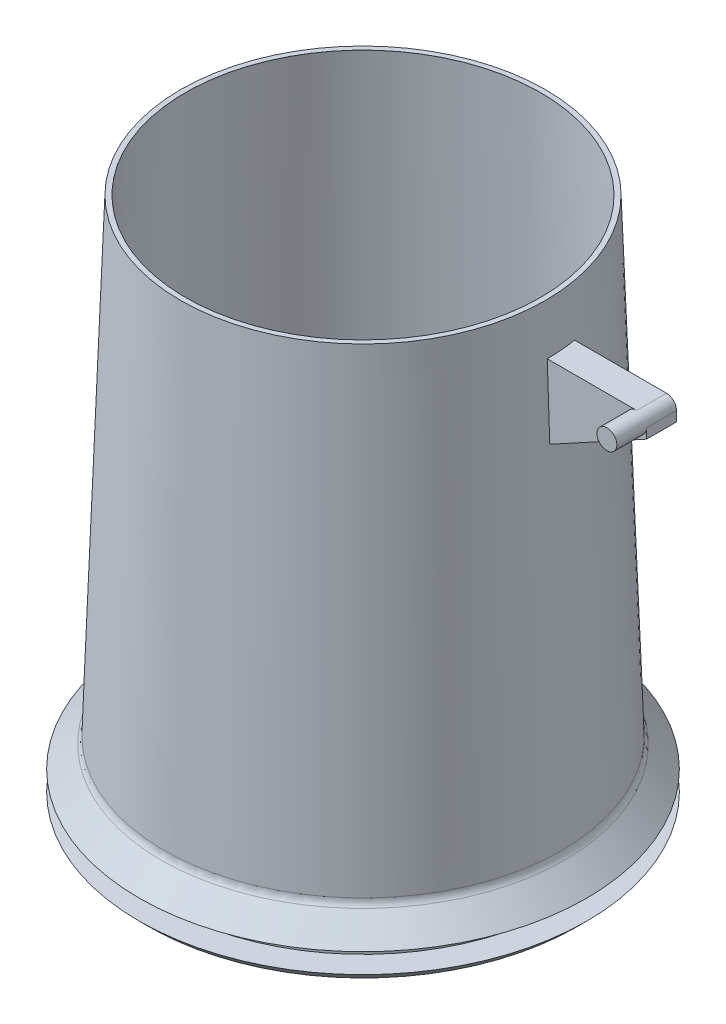
ISO-10303-21;
HEADER;
FILE_DESCRIPTION(('STEP AP214'),'2;1');
FILE_NAME('part.step','',(''),(''),'','','');
FILE_SCHEMA(('AUTOMOTIVE_DESIGN { 1 0 10303 214 1 1 1 1 }'));
ENDSEC;
DATA;
#1=APPLICATION_CONTEXT('core data for automotive mechanical design processes');
#2=APPLICATION_PROTOCOL_DEFINITION('international standard','automotive_design',2000,#1);
#3=PRODUCT_CONTEXT('',#1,'mechanical');
#4=PRODUCT('Part','Part','',(#3));
#5=PRODUCT_RELATED_PRODUCT_CATEGORY('part','',(#4));
#6=PRODUCT_DEFINITION_FORMATION('','',#4);
#7=PRODUCT_DEFINITION_CONTEXT('part definition',#1,'design');
#8=PRODUCT_DEFINITION('design','',#6,#7);
#9=PRODUCT_DEFINITION_SHAPE('','',#8);
#10=(LENGTH_UNIT() NAMED_UNIT(*) SI_UNIT(.MILLI.,.METRE.));
#11=(NAMED_UNIT(*) PLANE_ANGLE_UNIT() SI_UNIT($,.RADIAN.));
#12=(NAMED_UNIT(*) SI_UNIT($,.STERADIAN.) SOLID_ANGLE_UNIT());
#13=UNCERTAINTY_MEASURE_WITH_UNIT(LENGTH_MEASURE(1.E-05),#10,'distance_accuracy_value','');
#14=(GEOMETRIC_REPRESENTATION_CONTEXT(3) GLOBAL_UNCERTAINTY_ASSIGNED_CONTEXT((#13)) GLOBAL_UNIT_ASSIGNED_CONTEXT((#10,
#11,#12)) REPRESENTATION_CONTEXT('',''));
#15=CARTESIAN_POINT('',(0.,0.,0.));
#16=DIRECTION('',(0.,0.,1.));
#17=DIRECTION('',(1.,0.,0.));
#18=AXIS2_PLACEMENT_3D('',#15,#16,#17);
#19=CARTESIAN_POINT('',(0.,0.,0.));
#20=DIRECTION('',(0.,0.,1.));
#21=DIRECTION('',(1.,0.,0.));
#22=AXIS2_PLACEMENT_3D('',#19,#20,#21);
#23=PLANE('',#22);
#24=DIRECTION('',(0.,1.,0.));
#25=VECTOR('',#24,1.);
#26=CARTESIAN_POINT('',(28.530331952933,2.22044604925031E-13,2.22261445359528E-13));
#27=LINE('',#26,#25);
#28=CARTESIAN_POINT('',(28.5303319529329,43.0000000000001,2.22369865576777E-13));
#29=VERTEX_POINT('',#28);
#30=CARTESIAN_POINT('',(28.5303319529329,44.,1.11347563114261E-13));
#31=VERTEX_POINT('',#30);
#32=EDGE_CURVE('E128',#29,#31,#27,.T.);
#33=ORIENTED_EDGE('',*,*,#32,.T.);
#34=CARTESIAN_POINT('',(27.5303319529328,44.,1.1145598333151E-13));
#35=DIRECTION('',(0.,0.,1.));
#36=DIRECTION('',(1.,0.,0.));
#37=AXIS2_PLACEMENT_3D('',#34,#35,#36);
#38=CIRCLE('',#37,1.);
#39=CARTESIAN_POINT('',(27.5303319529328,45.0000000000004,1.11347563114261E-13));
#40=VERTEX_POINT('',#39);
#41=EDGE_CURVE('E11',#31,#40,#38,.F.);
#42=ORIENTED_EDGE('',*,*,#41,.T.);
#43=DIRECTION('',(-1.,0.,0.));
#44=VECTOR('',#43,1.);
#45=CARTESIAN_POINT('',(2.42861286636753E-13,45.0000000000001,1.11130722679764E-13));
#46=LINE('',#45,#44);
#47=CARTESIAN_POINT('',(18.5303319529329,45.0000000000001,1.11347563114261E-13));
#48=VERTEX_POINT('',#47);
#49=EDGE_CURVE('E102',#40,#48,#46,.T.);
#50=ORIENTED_EDGE('',*,*,#49,.T.);
#51=DIRECTION('',(-0.0348994967025014,0.999390827019095,0.));
#52=VECTOR('',#51,1.);
#53=CARTESIAN_POINT('',(2.08166817117217E-13,575.639279220674,0.));
#54=LINE('',#53,#52);
#55=CARTESIAN_POINT('',(18.7858095543698,37.6840786971369,1.11347563114261E-13));
#56=VERTEX_POINT('',#55);
#57=EDGE_CURVE('E194',#48,#56,#54,.F.);
#58=ORIENTED_EDGE('',*,*,#57,.T.);
#59=DIRECTION('',(0.877868028730685,0.478902624896233,0.));
#60=VECTOR('',#59,1.);
#61=CARTESIAN_POINT('',(-11.534405338529,21.1435167625347,2.21936184707783E-13));
#62=LINE('',#61,#60);
#63=EDGE_CURVE('E111',#56,#29,#62,.T.);
#64=ORIENTED_EDGE('',*,*,#63,.T.);
#65=EDGE_LOOP('',(#33,#42,#50,#58,#64));
#66=FACE_BOUND('',#65,.T.);
#67=ADVANCED_FACE('F55',(#66),#23,.T.);
#68=CARTESIAN_POINT('',(1.11022302462516E-13,2.9142135623732,1.10913882245267E-13));
#69=DIRECTION('',(0.,-1.,0.));
#70=DIRECTION('',(1.,0.,0.));
#71=AXIS2_PLACEMENT_3D('',#68,#69,#70);
#72=CONICAL_SURFACE('',#71,20.,0.0349065850398873);
#73=CARTESIAN_POINT('',(0.,50.,1.11130722679764E-13));
#74=DIRECTION('',(0.,-1.,0.));
#75=DIRECTION('',(1.,0.,0.));
#76=AXIS2_PLACEMENT_3D('',#73,#74,#75);
#77=CIRCLE('',#76,18.3557281054739);
#78=CARTESIAN_POINT('',(18.3557281054739,50.,1.11703880704102E-13));
#79=VERTEX_POINT('',#78);
#80=EDGE_CURVE('E182',#79,#79,#77,.T.);
#81=ORIENTED_EDGE('',*,*,#80,.T.);
#82=EDGE_LOOP('',(#81));
#83=FACE_BOUND('',#82,.T.);
#84=CARTESIAN_POINT('',(1.11022302462516E-13,2.9142135623732,1.10913882245267E-13));
#85=DIRECTION('',(0.,-1.,0.));
#86=DIRECTION('',(1.,0.,0.));
#87=AXIS2_PLACEMENT_3D('',#84,#85,#86);
#88=CIRCLE('',#87,20.);
#89=CARTESIAN_POINT('',(20.0000000000001,2.91421356237321,1.11538382696619E-13));
#90=VERTEX_POINT('',#89);
#91=EDGE_CURVE('E186',#90,#90,#88,.T.);
#92=ORIENTED_EDGE('',*,*,#91,.F.);
#93=EDGE_LOOP('',(#92));
#94=FACE_BOUND('',#93,.T.);
#95=CARTESIAN_POINT('',(2.42861286636753E-13,45.0000000000001,1.11130722679764E-13));
#96=DIRECTION('',(0.,1.,0.));
#97=DIRECTION('',(-1.,0.,0.));
#98=AXIS2_PLACEMENT_3D('',#95,#96,#97);
#99=CIRCLE('',#98,18.5303319529327);
#100=CARTESIAN_POINT('',(18.2858743921608,45.0000000000001,-2.99999999999978));
#101=VERTEX_POINT('',#100);
#102=EDGE_CURVE('E75',#101,#48,#99,.F.);
#103=ORIENTED_EDGE('',*,*,#102,.F.);
#104=CARTESIAN_POINT('',(18.0199111100321,52.5142637070481,-2.99999999999989));
#105=CARTESIAN_POINT('',(18.1517468798483,48.7901915058977,-2.99999999999989));
#106=CARTESIAN_POINT('',(18.2835461188556,45.0661180122388,-2.99999999999989));
#107=CARTESIAN_POINT('',(18.5470715352514,37.617968439919,-2.99999999999989));
#108=CARTESIAN_POINT('',(18.67879771264,33.8938923612581,-2.99999999999989));
#109=CARTESIAN_POINT('',(18.8104873592195,30.1698149900886,-2.99999999999989));
#110=B_SPLINE_CURVE_WITH_KNOTS('',3,(#104,#105,#106,#107,#108,#109),.UNSPECIFIED.,.F.,.F.,(4,2,
4),(0.,11.1792150811308,22.3584301622165),.UNSPECIFIED.);
#111=CARTESIAN_POINT('',(18.5447200198077,37.6840786971371,-2.99999999999989));
#112=VERTEX_POINT('',#111);
#113=EDGE_CURVE('E64',#101,#112,#110,.T.);
#114=ORIENTED_EDGE('',*,*,#113,.T.);
#115=CARTESIAN_POINT('',(0.,37.6840786971371,1.11130722679764E-13));
#116=DIRECTION('',(0.,-1.,0.));
#117=DIRECTION('',(0.,0.,-1.));
#118=AXIS2_PLACEMENT_3D('',#115,#116,#117);
#119=CIRCLE('',#118,18.7858095543697);
#120=EDGE_CURVE('E199',#56,#112,#119,.F.);
#121=ORIENTED_EDGE('',*,*,#120,.F.);
#122=ORIENTED_EDGE('',*,*,#57,.F.);
#123=EDGE_LOOP('',(#103,#114,#121,#122));
#124=FACE_BOUND('',#123,.T.);
#125=ADVANCED_FACE('F208',(#83,#94,#124),#72,.T.);
#126=CARTESIAN_POINT('',(0.,0.,0.));
#127=DIRECTION('',(0.,-1.,0.));
#128=DIRECTION('',(1.,0.,0.));
#129=AXIS2_PLACEMENT_3D('',#126,#127,#128);
#130=CONICAL_SURFACE('',#129,22.5,0.785398163397454);
#131=CARTESIAN_POINT('',(1.11022302462516E-13,2.20710678118662,1.11022302462516E-13));
#132=DIRECTION('',(0.,-1.,0.));
#133=DIRECTION('',(1.,0.,0.));
#134=AXIS2_PLACEMENT_3D('',#131,#132,#133);
#135=CIRCLE('',#134,20.2928932188135);
#136=CARTESIAN_POINT('',(20.2928932188134,2.20710678118661,0.));
#137=VERTEX_POINT('',#136);
#138=EDGE_CURVE('E190',#137,#137,#135,.T.);
#139=CARTESIAN_POINT('',(0.,0.,0.));
#140=DIRECTION('',(0.,-1.,0.));
#141=DIRECTION('',(1.,0.,0.));
#142=AXIS2_PLACEMENT_3D('',#139,#140,#141);
#143=CIRCLE('',#142,22.5);
#144=CARTESIAN_POINT('',(22.5,0.,0.));
#145=VERTEX_POINT('',#144);
#146=EDGE_CURVE('E144',#145,#145,#143,.T.);
#147=CARTESIAN_POINT('',(20.2928932188134,2.20710678118661,0.));
#148=CARTESIAN_POINT('',(20.3158839144507,2.18411608554925,0.));
#149=CARTESIAN_POINT('',(20.3388746100881,2.16112538991189,0.));
#150=CARTESIAN_POINT('',(20.3848560013628,2.11514399863717,0.));
#151=CARTESIAN_POINT('',(20.4078466970002,2.09215330299981,0.));
#152=CARTESIAN_POINT('',(20.4538280882749,2.04617191172509,0.));
#153=CARTESIAN_POINT('',(20.4768187839123,2.02318121608772,0.));
#154=CARTESIAN_POINT('',(20.522800175187,1.977199824813,0.));
#155=CARTESIAN_POINT('',(20.5457908708243,1.95420912917564,0.));
#156=CARTESIAN_POINT('',(20.5917722620991,1.90822773790092,0.));
#157=CARTESIAN_POINT('',(20.6147629577364,1.88523704226356,0.));
#158=CARTESIAN_POINT('',(20.6607443490111,1.83925565098884,0.));
#159=CARTESIAN_POINT('',(20.6837350446485,1.81626495535148,0.));
#160=CARTESIAN_POINT('',(20.7297164359232,1.77028356407676,0.));
#161=CARTESIAN_POINT('',(20.7527071315606,1.7472928684394,0.));
#162=CARTESIAN_POINT('',(20.7986885228353,1.70131147716468,0.));
#163=CARTESIAN_POINT('',(20.8216792184727,1.67832078152732,0.));
#164=CARTESIAN_POINT('',(20.8676606097474,1.6323393902526,0.));
#165=CARTESIAN_POINT('',(20.8906513053848,1.60934869461523,0.));
#166=CARTESIAN_POINT('',(20.9366326966595,1.56336730334051,0.));
#167=CARTESIAN_POINT('',(20.9596233922968,1.54037660770315,0.));
#168=CARTESIAN_POINT('',(21.0056047835716,1.49439521642843,0.));
#169=CARTESIAN_POINT('',(21.0285954792089,1.47140452079107,0.));
#170=CARTESIAN_POINT('',(21.0745768704836,1.42542312951635,0.));
#171=CARTESIAN_POINT('',(21.097567566121,1.40243243387899,0.));
#172=CARTESIAN_POINT('',(21.1435489573957,1.35645104260427,0.));
#173=CARTESIAN_POINT('',(21.1665396530331,1.33346034696691,0.));
#174=CARTESIAN_POINT('',(21.2125210443078,1.28747895569219,0.));
#175=CARTESIAN_POINT('',(21.2355117399452,1.26448826005483,0.));
#176=CARTESIAN_POINT('',(21.2814931312199,1.2185068687801,0.));
#177=CARTESIAN_POINT('',(21.3044838268572,1.19551617314274,0.));
#178=CARTESIAN_POINT('',(21.350465218132,1.14953478186802,0.));
#179=CARTESIAN_POINT('',(21.3734559137693,1.12654408623066,0.));
#180=CARTESIAN_POINT('',(21.4194373050441,1.08056269495594,0.));
#181=CARTESIAN_POINT('',(21.4424280006814,1.05757199931858,0.));
#182=CARTESIAN_POINT('',(21.4884093919561,1.01159060804386,0.));
#183=CARTESIAN_POINT('',(21.5114000875935,0.988599912406498,0.));
#184=CARTESIAN_POINT('',(21.5573814788682,0.942618521131777,0.));
#185=CARTESIAN_POINT('',(21.5803721745056,0.919627825494416,0.));
#186=CARTESIAN_POINT('',(21.6263535657803,0.873646434219696,0.));
#187=CARTESIAN_POINT('',(21.6493442614177,0.850655738582335,0.));
#188=CARTESIAN_POINT('',(21.6953256526924,0.804674347307613,0.));
#189=CARTESIAN_POINT('',(21.7183163483297,0.781683651670253,0.));
#190=CARTESIAN_POINT('',(21.7642977396045,0.735702260395532,0.));
#191=CARTESIAN_POINT('',(21.7872884352418,0.712711564758171,0.));
#192=CARTESIAN_POINT('',(21.8332698265165,0.66673017348345,0.));
#193=CARTESIAN_POINT('',(21.8562605221539,0.643739477846089,0.));
#194=CARTESIAN_POINT('',(21.9022419134286,0.597758086571368,0.));
#195=CARTESIAN_POINT('',(21.925232609066,0.574767390934008,0.));
#196=CARTESIAN_POINT('',(21.9712140003407,0.528785999659286,0.));
#197=CARTESIAN_POINT('',(21.9942046959781,0.505795304021925,0.));
#198=CARTESIAN_POINT('',(22.0401860872528,0.459813912747204,0.));
#199=CARTESIAN_POINT('',(22.0631767828902,0.436823217109844,0.));
#200=CARTESIAN_POINT('',(22.1091581741649,0.390841825835123,0.));
#201=CARTESIAN_POINT('',(22.1321488698022,0.367851130197762,0.));
#202=CARTESIAN_POINT('',(22.178130261077,0.321869738923041,0.));
#203=CARTESIAN_POINT('',(22.2011209567143,0.29887904328568,0.));
#204=CARTESIAN_POINT('',(22.247102347989,0.252897652010959,0.));
#205=CARTESIAN_POINT('',(22.2700930436264,0.229906956373599,0.));
#206=CARTESIAN_POINT('',(22.3160744349011,0.183925565098877,0.));
#207=CARTESIAN_POINT('',(22.3390651305385,0.160934869461517,0.));
#208=CARTESIAN_POINT('',(22.3850465218132,0.114953478186796,0.));
#209=CARTESIAN_POINT('',(22.4080372174506,0.0919627825494351,0.));
#210=CARTESIAN_POINT('',(22.4540186087253,0.045981391274714,0.));
#211=CARTESIAN_POINT('',(22.4770093043627,0.0229906956373534,0.));
#212=CARTESIAN_POINT('',(22.5,0.,0.));
#213=B_SPLINE_CURVE_WITH_KNOTS('',3,(#147,#148,#149,#150,#151,#152,#153,#154,#155,#156,#157,
#158,#159,#160,#161,#162,#163,#164,#165,#166,#167,#168,#169,#170,#171,#172,#173,#174,#175,#176,
#177,#178,#179,#180,#181,#182,#183,#184,#185,#186,#187,#188,#189,#190,#191,#192,#193,#194,#195,
#196,#197,#198,#199,#200,#201,#202,#203,#204,#205,#206,#207,#208,#209,#210,#211,#212),
.UNSPECIFIED.,.F.,.F.,(4,2,2,2,2,2,2,2,2,2,2,2,2,2,2,2,2,2,2,2,2,2,2,2,2,2,2,2,2,2,2,2,4),(0.,
0.0975412607362421,0.195082521472484,0.292623782208727,0.390165042944969,0.487706303681214,
0.585247564417456,0.682788825153698,0.78033008588994,0.877871346626182,0.975412607362424,
1.07295386809867,1.17049512883491,1.26803638957115,1.3655776503074,1.46311891104364,
1.56066017177988,1.65820143251612,1.75574269325236,1.85328395398861,1.95082521472485,
2.04836647546109,2.14590773619734,2.24344899693358,2.34099025766982,2.43853151840606,
2.53607277914231,2.63361403987855,2.73115530061479,2.82869656135103,2.92623782208727,
3.02377908282352,3.12132034355976),.UNSPECIFIED.);
#214=EDGE_CURVE('BSEAM57',#137,#145,#213,.T.);
#215=ORIENTED_EDGE('',*,*,#138,.T.);
#216=ORIENTED_EDGE('',*,*,#146,.F.);
#217=ORIENTED_EDGE('',*,*,#214,.T.);
#218=ORIENTED_EDGE('',*,*,#214,.F.);
#219=EDGE_LOOP('',(#215,#217,#216,#218));
#220=FACE_BOUND('',#219,.T.);
#221=ADVANCED_FACE('F57',(#220),#130,.T.);
#222=CARTESIAN_POINT('',(1.11022302462516E-13,2.9142135623732,1.10913882245267E-13));
#223=DIRECTION('',(0.,-1.,0.));
#224=DIRECTION('',(1.,0.,0.));
#225=AXIS2_PLACEMENT_3D('',#222,#223,#224);
#226=TOROIDAL_SURFACE('',#225,21.,1.);
#227=ORIENTED_EDGE('',*,*,#91,.T.);
#228=EDGE_LOOP('',(#227));
#229=FACE_BOUND('',#228,.T.);
#230=ORIENTED_EDGE('',*,*,#138,.F.);
#231=EDGE_LOOP('',(#230));
#232=FACE_BOUND('',#231,.T.);
#233=ADVANCED_FACE('F264',(#229,#232),#226,.F.);
#234=CARTESIAN_POINT('',(0.,50.,1.11130722679764E-13));
#235=DIRECTION('',(0.,-1.,0.));
#236=DIRECTION('',(1.,0.,0.));
#237=AXIS2_PLACEMENT_3D('',#234,#235,#236);
#238=PLANE('',#237);
#239=ORIENTED_EDGE('',*,*,#80,.F.);
#240=EDGE_LOOP('',(#239));
#241=FACE_BOUND('',#240,.T.);
#242=CARTESIAN_POINT('',(0.,50.,1.11130722679764E-13));
#243=DIRECTION('',(0.,-1.,0.));
#244=DIRECTION('',(1.,0.,0.));
#245=AXIS2_PLACEMENT_3D('',#242,#243,#244);
#246=CIRCLE('',#245,17.8560326919644);
#247=CARTESIAN_POINT('',(17.8560326919644,50.,0.));
#248=VERTEX_POINT('',#247);
#249=EDGE_CURVE('E178',#248,#248,#246,.T.);
#250=ORIENTED_EDGE('',*,*,#249,.T.);
#251=EDGE_LOOP('',(#250));
#252=FACE_BOUND('',#251,.T.);
#253=ADVANCED_FACE('F261',(#241,#252),#238,.F.);
#254=CARTESIAN_POINT('',(0.,0.,0.));
#255=DIRECTION('',(0.,-1.,0.));
#256=DIRECTION('',(1.,0.,0.));
#257=AXIS2_PLACEMENT_3D('',#254,#255,#256);
#258=CYLINDRICAL_SURFACE('',#257,17.8560326919644);
#259=CARTESIAN_POINT('',(1.31838984174237E-13,49.9825502516489,0.));
#260=DIRECTION('',(0.,-1.,0.));
#261=DIRECTION('',(1.,0.,0.));
#262=AXIS2_PLACEMENT_3D('',#259,#260,#261);
#263=CIRCLE('',#262,17.8560326919644);
#264=CARTESIAN_POINT('',(17.8560326919644,49.9825502516489,0.));
#265=VERTEX_POINT('',#264);
#266=EDGE_CURVE('E174',#265,#265,#263,.T.);
#267=CARTESIAN_POINT('',(17.8560326919644,50.,0.));
#268=CARTESIAN_POINT('',(17.8560326919644,49.999818231788,0.));
#269=CARTESIAN_POINT('',(17.8560326919644,49.999636463576,0.));
#270=CARTESIAN_POINT('',(17.8560326919644,49.9992729271521,0.));
#271=CARTESIAN_POINT('',(17.8560326919644,49.9990911589401,0.));
#272=CARTESIAN_POINT('',(17.8560326919644,49.9987276225161,0.));
#273=CARTESIAN_POINT('',(17.8560326919644,49.9985458543041,0.));
#274=CARTESIAN_POINT('',(17.8560326919644,49.9981823178801,0.));
#275=CARTESIAN_POINT('',(17.8560326919644,49.9980005496681,0.));
#276=CARTESIAN_POINT('',(17.8560326919644,49.9976370132441,0.));
#277=CARTESIAN_POINT('',(17.8560326919644,49.9974552450321,0.));
#278=CARTESIAN_POINT('',(17.8560326919644,49.9970917086082,0.));
#279=CARTESIAN_POINT('',(17.8560326919644,49.9969099403962,0.));
#280=CARTESIAN_POINT('',(17.8560326919644,49.9965464039722,0.));
#281=CARTESIAN_POINT('',(17.8560326919644,49.9963646357602,0.));
#282=CARTESIAN_POINT('',(17.8560326919644,49.9960010993362,0.));
#283=CARTESIAN_POINT('',(17.8560326919644,49.9958193311242,0.));
#284=CARTESIAN_POINT('',(17.8560326919644,49.9954557947002,0.));
#285=CARTESIAN_POINT('',(17.8560326919644,49.9952740264883,0.));
#286=CARTESIAN_POINT('',(17.8560326919644,49.9949104900643,0.));
#287=CARTESIAN_POINT('',(17.8560326919644,49.9947287218523,0.));
#288=CARTESIAN_POINT('',(17.8560326919644,49.9943651854283,0.));
#289=CARTESIAN_POINT('',(17.8560326919644,49.9941834172163,0.));
#290=CARTESIAN_POINT('',(17.8560326919644,49.9938198807923,0.));
#291=CARTESIAN_POINT('',(17.8560326919644,49.9936381125803,0.));
#292=CARTESIAN_POINT('',(17.8560326919644,49.9932745761564,0.));
#293=CARTESIAN_POINT('',(17.8560326919644,49.9930928079444,0.));
#294=CARTESIAN_POINT('',(17.8560326919644,49.9927292715204,0.));
#295=CARTESIAN_POINT('',(17.8560326919644,49.9925475033084,0.));
#296=CARTESIAN_POINT('',(17.8560326919644,49.9921839668844,0.));
#297=CARTESIAN_POINT('',(17.8560326919644,49.9920021986724,0.));
#298=CARTESIAN_POINT('',(17.8560326919644,49.9916386622484,0.));
#299=CARTESIAN_POINT('',(17.8560326919644,49.9914568940364,0.));
#300=CARTESIAN_POINT('',(17.8560326919644,49.9910933576125,0.));
#301=CARTESIAN_POINT('',(17.8560326919644,49.9909115894005,0.));
#302=CARTESIAN_POINT('',(17.8560326919644,49.9905480529765,0.));
#303=CARTESIAN_POINT('',(17.8560326919644,49.9903662847645,0.));
#304=CARTESIAN_POINT('',(17.8560326919644,49.9900027483405,0.));
#305=CARTESIAN_POINT('',(17.8560326919644,49.9898209801285,0.));
#306=CARTESIAN_POINT('',(17.8560326919644,49.9894574437045,0.));
#307=CARTESIAN_POINT('',(17.8560326919644,49.9892756754925,0.));
#308=CARTESIAN_POINT('',(17.8560326919644,49.9889121390686,0.));
#309=CARTESIAN_POINT('',(17.8560326919644,49.9887303708566,0.));
#310=CARTESIAN_POINT('',(17.8560326919644,49.9883668344326,0.));
#311=CARTESIAN_POINT('',(17.8560326919644,49.9881850662206,0.));
#312=CARTESIAN_POINT('',(17.8560326919644,49.9878215297966,0.));
#313=CARTESIAN_POINT('',(17.8560326919644,49.9876397615846,0.));
#314=CARTESIAN_POINT('',(17.8560326919644,49.9872762251606,0.));
#315=CARTESIAN_POINT('',(17.8560326919644,49.9870944569486,0.));
#316=CARTESIAN_POINT('',(17.8560326919644,49.9867309205247,0.));
#317=CARTESIAN_POINT('',(17.8560326919644,49.9865491523127,0.));
#318=CARTESIAN_POINT('',(17.8560326919644,49.9861856158887,0.));
#319=CARTESIAN_POINT('',(17.8560326919644,49.9860038476767,0.));
#320=CARTESIAN_POINT('',(17.8560326919644,49.9856403112527,0.));
#321=CARTESIAN_POINT('',(17.8560326919644,49.9854585430407,0.));
#322=CARTESIAN_POINT('',(17.8560326919644,49.9850950066167,0.));
#323=CARTESIAN_POINT('',(17.8560326919644,49.9849132384048,0.));
#324=CARTESIAN_POINT('',(17.8560326919644,49.9845497019808,0.));
#325=CARTESIAN_POINT('',(17.8560326919644,49.9843679337688,0.));
#326=CARTESIAN_POINT('',(17.8560326919644,49.9840043973448,0.));
#327=CARTESIAN_POINT('',(17.8560326919644,49.9838226291328,0.));
#328=CARTESIAN_POINT('',(17.8560326919644,49.9834590927088,0.));
#329=CARTESIAN_POINT('',(17.8560326919644,49.9832773244968,0.));
#330=CARTESIAN_POINT('',(17.8560326919644,49.9829137880729,0.));
#331=CARTESIAN_POINT('',(17.8560326919644,49.9827320198609,0.));
#332=CARTESIAN_POINT('',(17.8560326919644,49.9825502516489,0.));
#333=B_SPLINE_CURVE_WITH_KNOTS('',3,(#267,#268,#269,#270,#271,#272,#273,#274,#275,#276,#277,
#278,#279,#280,#281,#282,#283,#284,#285,#286,#287,#288,#289,#290,#291,#292,#293,#294,#295,#296,
#297,#298,#299,#300,#301,#302,#303,#304,#305,#306,#307,#308,#309,#310,#311,#312,#313,#314,#315,
#316,#317,#318,#319,#320,#321,#322,#323,#324,#325,#326,#327,#328,#329,#330,#331,#332),
.UNSPECIFIED.,.F.,.F.,(4,2,2,2,2,2,2,2,2,2,2,2,2,2,2,2,2,2,2,2,2,2,2,2,2,2,2,2,2,2,2,2,4),(0.,
0.000545304635973798,0.0010906092719476,0.00163591390792139,0.00218121854389519,
0.00272652317986899,0.00327182781584279,0.00381713245181659,0.00436243708779038,
0.00490774172376418,0.00545304635973798,0.00599835099571178,0.00654365563168557,
0.00708896026765937,0.00763426490363317,0.00817956953960697,0.00872487417558077,
0.00927017881155456,0.00981548344752836,0.0103607880835022,0.010906092719476,0.0114513973554498,
0.0119967019914236,0.0125420066273974,0.0130873112633711,0.0136326158993449,0.0141779205353187,
0.0147232251712925,0.0152685298072663,0.0158138344432401,0.0163591390792139,0.0169044437151877,
0.0174497483511615),.UNSPECIFIED.);
#334=EDGE_CURVE('BSEAM258',#248,#265,#333,.T.);
#335=ORIENTED_EDGE('',*,*,#249,.F.);
#336=ORIENTED_EDGE('',*,*,#266,.T.);
#337=ORIENTED_EDGE('',*,*,#334,.T.);
#338=ORIENTED_EDGE('',*,*,#334,.F.);
#339=EDGE_LOOP('',(#335,#337,#336,#338));
#340=FACE_BOUND('',#339,.T.);
#341=ADVANCED_FACE('F258',(#340),#258,.F.);
#342=CARTESIAN_POINT('',(2.22044604925031E-13,-3.00000000000012,1.10913882245267E-13));
#343=DIRECTION('',(0.,-1.,0.));
#344=DIRECTION('',(1.,0.,0.));
#345=AXIS2_PLACEMENT_3D('',#342,#343,#344);
#346=CONICAL_SURFACE('',#345,19.7062241163872,0.0349065850398873);
#347=CARTESIAN_POINT('',(2.22044604925031E-13,-3.00000000000012,1.10913882245267E-13));
#348=DIRECTION('',(0.,-1.,0.));
#349=DIRECTION('',(1.,0.,0.));
#350=AXIS2_PLACEMENT_3D('',#347,#348,#349);
#351=CIRCLE('',#350,19.7062241163872);
#352=CARTESIAN_POINT('',(19.7062241163874,-3.00000000000013,1.11529209538023E-13));
#353=VERTEX_POINT('',#352);
#354=EDGE_CURVE('E170',#353,#353,#351,.T.);
#355=CARTESIAN_POINT('',(17.8560326919646,49.9825502516489,1.12477841509668E-13));
#356=CARTESIAN_POINT('',(17.8753055193024,49.4306486865275,1.1246795992663E-13));
#357=CARTESIAN_POINT('',(17.8945783466401,48.8787471214062,1.12458078343592E-13));
#358=CARTESIAN_POINT('',(17.9331240013156,47.7749439911635,1.12438315177516E-13));
#359=CARTESIAN_POINT('',(17.9523968286533,47.2230424260421,1.12428433594478E-13));
#360=CARTESIAN_POINT('',(17.9909424833288,46.1192392957995,1.12408670428402E-13));
#361=CARTESIAN_POINT('',(18.0102153106665,45.5673377306781,1.12398788845364E-13));
#362=CARTESIAN_POINT('',(18.048760965342,44.4635346004354,1.12379025679289E-13));
#363=CARTESIAN_POINT('',(18.0680337926797,43.9116330353141,1.12369144096251E-13));
#364=CARTESIAN_POINT('',(18.1065794473552,42.8078299050714,1.12349380930175E-13));
#365=CARTESIAN_POINT('',(18.1258522746929,42.25592833995,1.12339499347137E-13));
#366=CARTESIAN_POINT('',(18.1643979293684,41.1521252097074,1.12319736181061E-13));
#367=CARTESIAN_POINT('',(18.1836707567062,40.600223644586,1.12309854598023E-13));
#368=CARTESIAN_POINT('',(18.2222164113816,39.4964205143433,1.12290091431947E-13));
#369=CARTESIAN_POINT('',(18.2414892387194,38.944518949222,1.12280209848909E-13));
#370=CARTESIAN_POINT('',(18.2800348933948,37.8407158189793,1.12260446682833E-13));
#371=CARTESIAN_POINT('',(18.2993077207326,37.288814253858,1.12250565099795E-13));
#372=CARTESIAN_POINT('',(18.3378533754081,36.1850111236153,1.12230801933719E-13));
#373=CARTESIAN_POINT('',(18.3571262027458,35.6331095584939,1.12220920350681E-13));
#374=CARTESIAN_POINT('',(18.3956718574213,34.5293064282512,1.12201157184605E-13));
#375=CARTESIAN_POINT('',(18.414944684759,33.9774048631299,1.12191275601567E-13));
#376=CARTESIAN_POINT('',(18.4534903394345,32.8736017328872,1.12171512435491E-13));
#377=CARTESIAN_POINT('',(18.4727631667722,32.3217001677659,1.12161630852453E-13));
#378=CARTESIAN_POINT('',(18.5113088214477,31.2178970375232,1.12141867686377E-13));
#379=CARTESIAN_POINT('',(18.5305816487854,30.6659954724018,1.12131986103339E-13));
#380=CARTESIAN_POINT('',(18.5691273034609,29.5621923421591,1.12112222937263E-13));
#381=CARTESIAN_POINT('',(18.5884001307986,29.0102907770378,1.12102341354225E-13));
#382=CARTESIAN_POINT('',(18.6269457854741,27.9064876467951,1.12082578188149E-13));
#383=CARTESIAN_POINT('',(18.6462186128119,27.3545860816738,1.12072696605111E-13));
#384=CARTESIAN_POINT('',(18.6847642674873,26.2507829514311,1.12052933439035E-13));
#385=CARTESIAN_POINT('',(18.7040370948251,25.6988813863097,1.12043051855998E-13));
#386=CARTESIAN_POINT('',(18.7425827495005,24.5950782560671,1.12023288689922E-13));
#387=CARTESIAN_POINT('',(18.7618555768383,24.0431766909457,1.12013407106884E-13));
#388=CARTESIAN_POINT('',(18.8004012315138,22.939373560703,1.11993643940808E-13));
#389=CARTESIAN_POINT('',(18.8196740588515,22.3874719955817,1.1198376235777E-13));
#390=CARTESIAN_POINT('',(18.858219713527,21.283668865339,1.11963999191694E-13));
#391=CARTESIAN_POINT('',(18.8774925408647,20.7317673002176,1.11954117608656E-13));
#392=CARTESIAN_POINT('',(18.9160381955402,19.627964169975,1.1193435444258E-13));
#393=CARTESIAN_POINT('',(18.9353110228779,19.0760626048536,1.11924472859542E-13));
#394=CARTESIAN_POINT('',(18.9738566775534,17.9722594746109,1.11904709693466E-13));
#395=CARTESIAN_POINT('',(18.9931295048911,17.4203579094896,1.11894828110428E-13));
#396=CARTESIAN_POINT('',(19.0316751595666,16.3165547792469,1.11875064944352E-13));
#397=CARTESIAN_POINT('',(19.0509479869043,15.7646532141256,1.11865183361314E-13));
#398=CARTESIAN_POINT('',(19.0894936415798,14.6608500838829,1.11845420195238E-13));
#399=CARTESIAN_POINT('',(19.1087664689176,14.1089485187615,1.118355386122E-13));
#400=CARTESIAN_POINT('',(19.147312123593,13.0051453885188,1.11815775446124E-13));
#401=CARTESIAN_POINT('',(19.1665849509308,12.4532438233975,1.11805893863086E-13));
#402=CARTESIAN_POINT('',(19.2051306056062,11.3494406931548,1.1178613069701E-13));
#403=CARTESIAN_POINT('',(19.224403432944,10.7975391280335,1.11776249113972E-13));
#404=CARTESIAN_POINT('',(19.2629490876195,9.69373599779077,1.11756485947896E-13));
#405=CARTESIAN_POINT('',(19.2822219149572,9.14183443266943,1.11746604364858E-13));
#406=CARTESIAN_POINT('',(19.3207675696327,8.03803130242675,1.11726841198783E-13));
#407=CARTESIAN_POINT('',(19.3400403969704,7.4861297373054,1.11716959615745E-13));
#408=CARTESIAN_POINT('',(19.3785860516459,6.38232660706271,1.11697196449669E-13));
#409=CARTESIAN_POINT('',(19.3978588789836,5.83042504194137,1.11687314866631E-13));
#410=CARTESIAN_POINT('',(19.4364045336591,4.72662191169868,1.11667551700555E-13));
#411=CARTESIAN_POINT('',(19.4556773609968,4.17472034657734,1.11657670117517E-13));
#412=CARTESIAN_POINT('',(19.4942230156723,3.07091721633465,1.11637906951441E-13));
#413=CARTESIAN_POINT('',(19.51349584301,2.51901565121331,1.11628025368403E-13));
#414=CARTESIAN_POINT('',(19.5520414976855,1.41521252097062,1.11608262202327E-13));
#415=CARTESIAN_POINT('',(19.5713143250233,0.863310955849281,1.11598380619289E-13));
#416=CARTESIAN_POINT('',(19.6098599796987,-0.240492174393406,1.11578617453213E-13));
#417=CARTESIAN_POINT('',(19.6291328070365,-0.792393739514749,1.11568735870175E-13));
#418=CARTESIAN_POINT('',(19.6676784617119,-1.89619686975744,1.11548972704099E-13));
#419=CARTESIAN_POINT('',(19.6869512890497,-2.44809843487878,1.11539091121061E-13));
#420=CARTESIAN_POINT('',(19.7062241163874,-3.00000000000012,1.11529209538023E-13));
#421=B_SPLINE_CURVE_WITH_KNOTS('',3,(#355,#356,#357,#358,#359,#360,#361,#362,#363,#364,#365,
#366,#367,#368,#369,#370,#371,#372,#373,#374,#375,#376,#377,#378,#379,#380,#381,#382,#383,#384,
#385,#386,#387,#388,#389,#390,#391,#392,#393,#394,#395,#396,#397,#398,#399,#400,#401,#402,#403,
#404,#405,#406,#407,#408,#409,#410,#411,#412,#413,#414,#415,#416,#417,#418,#419,#420),
.UNSPECIFIED.,.F.,.F.,(4,2,2,2,2,2,2,2,2,2,2,2,2,2,2,2,2,2,2,2,2,2,2,2,2,2,2,2,2,2,2,2,4),(0.,
1.65671392072162,3.31342784144325,4.97014176216486,6.62685568288649,8.28356960360811,
9.94028352432973,11.5969974450514,13.253711365773,14.9104252864946,16.5671392072162,
18.2238531279378,19.8805670486595,21.5372809693811,23.1939948901027,24.8507088108243,
26.507422731546,28.1641366522676,29.8208505729892,31.4775644937108,33.1342784144325,
34.7909923351541,36.4477062558757,38.1044201765973,39.7611340973189,41.4178480180406,
43.0745619387622,44.7312758594838,46.3879897802054,48.044703700927,49.7014176216487,
51.3581315423703,53.0148454630919),.UNSPECIFIED.);
#422=EDGE_CURVE('BSEAM254',#265,#353,#421,.T.);
#423=ORIENTED_EDGE('',*,*,#266,.F.);
#424=ORIENTED_EDGE('',*,*,#354,.T.);
#425=ORIENTED_EDGE('',*,*,#422,.T.);
#426=ORIENTED_EDGE('',*,*,#422,.F.);
#427=EDGE_LOOP('',(#423,#425,#424,#426));
#428=FACE_BOUND('',#427,.T.);
#429=ADVANCED_FACE('F254',(#428),#346,.F.);
#430=CARTESIAN_POINT('',(2.22044604925031E-13,-3.00000000000012,1.10913882245267E-13));
#431=DIRECTION('',(0.,-1.,0.));
#432=DIRECTION('',(1.,0.,0.));
#433=AXIS2_PLACEMENT_3D('',#430,#431,#432);
#434=PLANE('',#433);
#435=CARTESIAN_POINT('',(2.22044604925031E-13,-3.00000000000012,1.10913882245267E-13));
#436=DIRECTION('',(0.,-1.,0.));
#437=DIRECTION('',(1.,0.,0.));
#438=AXIS2_PLACEMENT_3D('',#435,#436,#437);
#439=CIRCLE('',#438,21.5);
#440=CARTESIAN_POINT('',(-21.4999999999996,-3.00000000000011,1.10223549246879E-13));
#441=VERTEX_POINT('',#440);
#442=EDGE_CURVE('E166',#441,#441,#439,.T.);
#443=ORIENTED_EDGE('',*,*,#442,.T.);
#444=EDGE_LOOP('',(#443));
#445=FACE_BOUND('',#444,.T.);
#446=ORIENTED_EDGE('',*,*,#354,.F.);
#447=EDGE_LOOP('',(#446));
#448=FACE_BOUND('',#447,.T.);
#449=ADVANCED_FACE('F250',(#445,#448),#434,.T.);
#450=CARTESIAN_POINT('',(1.11022302462516E-13,-1.99999999999978,1.10913882245267E-13));
#451=DIRECTION('',(0.,1.,0.));
#452=DIRECTION('',(-1.,0.,0.));
#453=AXIS2_PLACEMENT_3D('',#450,#451,#452);
#454=CONICAL_SURFACE('',#453,22.5,0.785398163397443);
#455=CARTESIAN_POINT('',(1.11022302462516E-13,-1.99999999999978,1.10913882245267E-13));
#456=DIRECTION('',(0.,-1.,0.));
#457=DIRECTION('',(1.,0.,0.));
#458=AXIS2_PLACEMENT_3D('',#455,#456,#457);
#459=CIRCLE('',#458,22.5);
#460=CARTESIAN_POINT('',(-22.4999999999999,-1.99999999999977,1.10211319237496E-13));
#461=VERTEX_POINT('',#460);
#462=EDGE_CURVE('E162',#461,#461,#459,.T.);
#463=CARTESIAN_POINT('',(-21.4999999999996,-3.00000000000011,1.10223549246879E-13));
#464=CARTESIAN_POINT('',(-21.5104166666662,-2.98958333333344,1.10223421850948E-13));
#465=CARTESIAN_POINT('',(-21.5208333333329,-2.97916666666677,1.10223294455017E-13));
#466=CARTESIAN_POINT('',(-21.5416666666663,-2.95833333333343,1.10223039663154E-13));
#467=CARTESIAN_POINT('',(-21.5520833333329,-2.94791666666676,1.10222912267223E-13));
#468=CARTESIAN_POINT('',(-21.5729166666663,-2.92708333333342,1.10222657475361E-13));
#469=CARTESIAN_POINT('',(-21.5833333333329,-2.91666666666675,1.1022253007943E-13));
#470=CARTESIAN_POINT('',(-21.6041666666663,-2.89583333333341,1.10222275287568E-13));
#471=CARTESIAN_POINT('',(-21.6145833333329,-2.88541666666674,1.10222147891637E-13));
#472=CARTESIAN_POINT('',(-21.6354166666663,-2.8645833333334,1.10221893099775E-13));
#473=CARTESIAN_POINT('',(-21.645833333333,-2.85416666666673,1.10221765703844E-13));
#474=CARTESIAN_POINT('',(-21.6666666666663,-2.83333333333339,1.10221510911982E-13));
#475=CARTESIAN_POINT('',(-21.677083333333,-2.82291666666672,1.10221383516051E-13));
#476=CARTESIAN_POINT('',(-21.6979166666663,-2.80208333333338,1.10221128724188E-13));
#477=CARTESIAN_POINT('',(-21.708333333333,-2.79166666666671,1.10221001328257E-13));
#478=CARTESIAN_POINT('',(-21.7291666666663,-2.77083333333337,1.10220746536395E-13));
#479=CARTESIAN_POINT('',(-21.739583333333,-2.7604166666667,1.10220619140464E-13));
#480=CARTESIAN_POINT('',(-21.7604166666663,-2.73958333333336,1.10220364348602E-13));
#481=CARTESIAN_POINT('',(-21.770833333333,-2.72916666666669,1.10220236952671E-13));
#482=CARTESIAN_POINT('',(-21.7916666666663,-2.70833333333335,1.10219982160809E-13));
#483=CARTESIAN_POINT('',(-21.802083333333,-2.69791666666668,1.10219854764878E-13));
#484=CARTESIAN_POINT('',(-21.8229166666663,-2.67708333333334,1.10219599973016E-13));
#485=CARTESIAN_POINT('',(-21.833333333333,-2.66666666666667,1.10219472577085E-13));
#486=CARTESIAN_POINT('',(-21.8541666666664,-2.64583333333333,1.10219217785222E-13));
#487=CARTESIAN_POINT('',(-21.864583333333,-2.63541666666666,1.10219090389291E-13));
#488=CARTESIAN_POINT('',(-21.8854166666664,-2.61458333333332,1.10218835597429E-13));
#489=CARTESIAN_POINT('',(-21.895833333333,-2.60416666666665,1.10218708201498E-13));
#490=CARTESIAN_POINT('',(-21.9166666666664,-2.58333333333331,1.10218453409636E-13));
#491=CARTESIAN_POINT('',(-21.927083333333,-2.57291666666663,1.10218326013705E-13));
#492=CARTESIAN_POINT('',(-21.9479166666664,-2.55208333333329,1.10218071221843E-13));
#493=CARTESIAN_POINT('',(-21.9583333333331,-2.54166666666662,1.10217943825912E-13));
#494=CARTESIAN_POINT('',(-21.9791666666664,-2.52083333333328,1.1021768903405E-13));
#495=CARTESIAN_POINT('',(-21.9895833333331,-2.51041666666661,1.10217561638119E-13));
#496=CARTESIAN_POINT('',(-22.0104166666664,-2.48958333333327,1.10217306846257E-13));
#497=CARTESIAN_POINT('',(-22.0208333333331,-2.4791666666666,1.10217179450325E-13));
#498=CARTESIAN_POINT('',(-22.0416666666664,-2.45833333333326,1.10216924658463E-13));
#499=CARTESIAN_POINT('',(-22.0520833333331,-2.44791666666659,1.10216797262532E-13));
#500=CARTESIAN_POINT('',(-22.0729166666664,-2.42708333333325,1.1021654247067E-13));
#501=CARTESIAN_POINT('',(-22.0833333333331,-2.41666666666658,1.10216415074739E-13));
#502=CARTESIAN_POINT('',(-22.1041666666664,-2.39583333333324,1.10216160282877E-13));
#503=CARTESIAN_POINT('',(-22.1145833333331,-2.38541666666657,1.10216032886946E-13));
#504=CARTESIAN_POINT('',(-22.1354166666664,-2.36458333333323,1.10215778095084E-13));
#505=CARTESIAN_POINT('',(-22.1458333333331,-2.35416666666656,1.10215650699153E-13));
#506=CARTESIAN_POINT('',(-22.1666666666665,-2.33333333333322,1.10215395907291E-13));
#507=CARTESIAN_POINT('',(-22.1770833333331,-2.32291666666655,1.10215268511359E-13));
#508=CARTESIAN_POINT('',(-22.1979166666665,-2.30208333333321,1.10215013719497E-13));
#509=CARTESIAN_POINT('',(-22.2083333333331,-2.29166666666654,1.10214886323566E-13));
#510=CARTESIAN_POINT('',(-22.2291666666665,-2.2708333333332,1.10214631531704E-13));
#511=CARTESIAN_POINT('',(-22.2395833333332,-2.26041666666653,1.10214504135773E-13));
#512=CARTESIAN_POINT('',(-22.2604166666665,-2.23958333333319,1.10214249343911E-13));
#513=CARTESIAN_POINT('',(-22.2708333333332,-2.22916666666652,1.1021412194798E-13));
#514=CARTESIAN_POINT('',(-22.2916666666665,-2.20833333333318,1.10213867156118E-13));
#515=CARTESIAN_POINT('',(-22.3020833333332,-2.19791666666651,1.10213739760187E-13));
#516=CARTESIAN_POINT('',(-22.3229166666665,-2.17708333333317,1.10213484968325E-13));
#517=CARTESIAN_POINT('',(-22.3333333333332,-2.1666666666665,1.10213357572394E-13));
#518=CARTESIAN_POINT('',(-22.3541666666665,-2.14583333333316,1.10213102780531E-13));
#519=CARTESIAN_POINT('',(-22.3645833333332,-2.13541666666648,1.102129753846E-13));
#520=CARTESIAN_POINT('',(-22.3854166666665,-2.11458333333314,1.10212720592738E-13));
#521=CARTESIAN_POINT('',(-22.3958333333332,-2.10416666666647,1.10212593196807E-13));
#522=CARTESIAN_POINT('',(-22.4166666666665,-2.08333333333313,1.10212338404945E-13));
#523=CARTESIAN_POINT('',(-22.4270833333332,-2.07291666666646,1.10212211009014E-13));
#524=CARTESIAN_POINT('',(-22.4479166666666,-2.05208333333312,1.10211956217152E-13));
#525=CARTESIAN_POINT('',(-22.4583333333332,-2.04166666666645,1.10211828821221E-13));
#526=CARTESIAN_POINT('',(-22.4791666666666,-2.02083333333311,1.10211574029359E-13));
#527=CARTESIAN_POINT('',(-22.4895833333332,-2.01041666666644,1.10211446633428E-13));
#528=CARTESIAN_POINT('',(-22.4999999999999,-1.99999999999977,1.10211319237496E-13));
#529=B_SPLINE_CURVE_WITH_KNOTS('',3,(#463,#464,#465,#466,#467,#468,#469,#470,#471,#472,#473,
#474,#475,#476,#477,#478,#479,#480,#481,#482,#483,#484,#485,#486,#487,#488,#489,#490,#491,#492,
#493,#494,#495,#496,#497,#498,#499,#500,#501,#502,#503,#504,#505,#506,#507,#508,#509,#510,#511,
#512,#513,#514,#515,#516,#517,#518,#519,#520,#521,#522,#523,#524,#525,#526,#527,#528),
.UNSPECIFIED.,.F.,.F.,(4,2,2,2,2,2,2,2,2,2,2,2,2,2,2,2,2,2,2,2,2,2,2,2,2,2,2,2,2,2,2,2,4),(0.,
0.0441941738241743,0.0883883476483483,0.132582521472523,0.176776695296697,0.220970869120871,
0.265165042945045,0.309359216769219,0.353553390593393,0.397747564417567,0.441941738241742,
0.486135912065916,0.53033008589009,0.574524259714264,0.618718433538438,0.662912607362612,
0.707106781186786,0.751300955010961,0.795495128835135,0.839689302659309,0.883883476483483,
0.928077650307657,0.972271824131831,1.01646599795601,1.06066017178018,1.10485434560435,
1.14904851942853,1.1932426932527,1.23743686707687,1.28163104090105,1.32582521472522,
1.3700193885494,1.41421356237357),.UNSPECIFIED.);
#530=EDGE_CURVE('BSEAM246',#441,#461,#529,.T.);
#531=ORIENTED_EDGE('',*,*,#442,.F.);
#532=ORIENTED_EDGE('',*,*,#462,.T.);
#533=ORIENTED_EDGE('',*,*,#530,.T.);
#534=ORIENTED_EDGE('',*,*,#530,.F.);
#535=EDGE_LOOP('',(#531,#533,#532,#534));
#536=FACE_BOUND('',#535,.T.);
#537=ADVANCED_FACE('F246',(#536),#454,.T.);
#538=CARTESIAN_POINT('',(1.11022302462516E-13,-1.99999999999978,1.10913882245267E-13));
#539=DIRECTION('',(0.,-1.,0.));
#540=DIRECTION('',(1.,0.,0.));
#541=AXIS2_PLACEMENT_3D('',#538,#539,#540);
#542=PLANE('',#541);
#543=ORIENTED_EDGE('',*,*,#462,.F.);
#544=EDGE_LOOP('',(#543));
#545=FACE_BOUND('',#544,.T.);
#546=CARTESIAN_POINT('',(1.11022302462516E-13,-1.99999999999978,1.10913882245267E-13));
#547=DIRECTION('',(0.,-1.,0.));
#548=DIRECTION('',(1.,0.,0.));
#549=AXIS2_PLACEMENT_3D('',#546,#547,#548);
#550=CIRCLE('',#549,20.);
#551=CARTESIAN_POINT('',(20.,-1.99999999999979,0.));
#552=VERTEX_POINT('',#551);
#553=EDGE_CURVE('E158',#552,#552,#550,.T.);
#554=ORIENTED_EDGE('',*,*,#553,.T.);
#555=EDGE_LOOP('',(#554));
#556=FACE_BOUND('',#555,.T.);
#557=ADVANCED_FACE('F242',(#545,#556),#542,.F.);
#558=CARTESIAN_POINT('',(0.,0.,0.));
#559=DIRECTION('',(0.,-1.,0.));
#560=DIRECTION('',(1.,0.,0.));
#561=AXIS2_PLACEMENT_3D('',#558,#559,#560);
#562=CYLINDRICAL_SURFACE('',#561,20.);
#563=CARTESIAN_POINT('',(0.,0.,0.));
#564=DIRECTION('',(0.,-1.,0.));
#565=DIRECTION('',(1.,0.,0.));
#566=AXIS2_PLACEMENT_3D('',#563,#564,#565);
#567=CIRCLE('',#566,20.);
#568=CARTESIAN_POINT('',(20.,0.,0.));
#569=VERTEX_POINT('',#568);
#570=EDGE_CURVE('E154',#569,#569,#567,.T.);
#571=CARTESIAN_POINT('',(20.,-1.99999999999979,0.));
#572=CARTESIAN_POINT('',(20.,-1.97916666666646,0.));
#573=CARTESIAN_POINT('',(20.,-1.95833333333312,0.));
#574=CARTESIAN_POINT('',(20.,-1.91666666666646,0.));
#575=CARTESIAN_POINT('',(20.,-1.89583333333313,0.));
#576=CARTESIAN_POINT('',(20.,-1.85416666666647,0.));
#577=CARTESIAN_POINT('',(20.,-1.83333333333314,0.));
#578=CARTESIAN_POINT('',(20.,-1.79166666666648,0.));
#579=CARTESIAN_POINT('',(20.,-1.77083333333314,0.));
#580=CARTESIAN_POINT('',(20.,-1.72916666666648,0.));
#581=CARTESIAN_POINT('',(20.,-1.70833333333315,0.));
#582=CARTESIAN_POINT('',(20.,-1.66666666666649,0.));
#583=CARTESIAN_POINT('',(20.,-1.64583333333316,0.));
#584=CARTESIAN_POINT('',(20.,-1.6041666666665,0.));
#585=CARTESIAN_POINT('',(20.,-1.58333333333317,0.));
#586=CARTESIAN_POINT('',(20.,-1.5416666666665,0.));
#587=CARTESIAN_POINT('',(20.,-1.52083333333317,0.));
#588=CARTESIAN_POINT('',(20.,-1.47916666666651,0.));
#589=CARTESIAN_POINT('',(20.,-1.45833333333318,0.));
#590=CARTESIAN_POINT('',(20.,-1.41666666666652,0.));
#591=CARTESIAN_POINT('',(20.,-1.39583333333319,0.));
#592=CARTESIAN_POINT('',(20.,-1.35416666666652,0.));
#593=CARTESIAN_POINT('',(20.,-1.33333333333319,0.));
#594=CARTESIAN_POINT('',(20.,-1.29166666666653,0.));
#595=CARTESIAN_POINT('',(20.,-1.2708333333332,0.));
#596=CARTESIAN_POINT('',(20.,-1.22916666666654,0.));
#597=CARTESIAN_POINT('',(20.,-1.20833333333321,0.));
#598=CARTESIAN_POINT('',(20.,-1.16666666666654,0.));
#599=CARTESIAN_POINT('',(20.,-1.14583333333321,0.));
#600=CARTESIAN_POINT('',(20.,-1.10416666666655,0.));
#601=CARTESIAN_POINT('',(20.,-1.08333333333322,0.));
#602=CARTESIAN_POINT('',(20.,-1.04166666666656,0.));
#603=CARTESIAN_POINT('',(20.,-1.02083333333323,0.));
#604=CARTESIAN_POINT('',(20.,-0.979166666666565,0.));
#605=CARTESIAN_POINT('',(20.,-0.958333333333234,0.));
#606=CARTESIAN_POINT('',(20.,-0.916666666666572,0.));
#607=CARTESIAN_POINT('',(20.,-0.895833333333241,0.));
#608=CARTESIAN_POINT('',(20.,-0.854166666666579,0.));
#609=CARTESIAN_POINT('',(20.,-0.833333333333248,0.));
#610=CARTESIAN_POINT('',(20.,-0.791666666666586,0.));
#611=CARTESIAN_POINT('',(20.,-0.770833333333255,0.));
#612=CARTESIAN_POINT('',(20.,-0.729166666666593,0.));
#613=CARTESIAN_POINT('',(20.,-0.708333333333262,0.));
#614=CARTESIAN_POINT('',(20.,-0.6666666666666,0.));
#615=CARTESIAN_POINT('',(20.,-0.645833333333269,0.));
#616=CARTESIAN_POINT('',(20.,-0.604166666666606,0.));
#617=CARTESIAN_POINT('',(20.,-0.583333333333276,0.));
#618=CARTESIAN_POINT('',(20.,-0.541666666666613,0.));
#619=CARTESIAN_POINT('',(20.,-0.520833333333282,0.));
#620=CARTESIAN_POINT('',(20.,-0.47916666666662,0.));
#621=CARTESIAN_POINT('',(20.,-0.458333333333289,0.));
#622=CARTESIAN_POINT('',(20.,-0.416666666666627,0.));
#623=CARTESIAN_POINT('',(20.,-0.395833333333296,0.));
#624=CARTESIAN_POINT('',(20.,-0.354166666666634,0.));
#625=CARTESIAN_POINT('',(20.,-0.333333333333303,0.));
#626=CARTESIAN_POINT('',(20.,-0.291666666666641,0.));
#627=CARTESIAN_POINT('',(20.,-0.27083333333331,0.));
#628=CARTESIAN_POINT('',(20.,-0.229166666666648,0.));
#629=CARTESIAN_POINT('',(20.,-0.208333333333317,0.));
#630=CARTESIAN_POINT('',(20.,-0.166666666666655,0.));
#631=CARTESIAN_POINT('',(20.,-0.145833333333324,0.));
#632=CARTESIAN_POINT('',(20.,-0.104166666666661,0.));
#633=CARTESIAN_POINT('',(20.,-0.0833333333333304,0.));
#634=CARTESIAN_POINT('',(20.,-0.0416666666666684,0.));
#635=CARTESIAN_POINT('',(20.,-0.0208333333333374,0.));
#636=CARTESIAN_POINT('',(20.,0.,0.));
#637=B_SPLINE_CURVE_WITH_KNOTS('',3,(#571,#572,#573,#574,#575,#576,#577,#578,#579,#580,#581,
#582,#583,#584,#585,#586,#587,#588,#589,#590,#591,#592,#593,#594,#595,#596,#597,#598,#599,#600,
#601,#602,#603,#604,#605,#606,#607,#608,#609,#610,#611,#612,#613,#614,#615,#616,#617,#618,#619,
#620,#621,#622,#623,#624,#625,#626,#627,#628,#629,#630,#631,#632,#633,#634,#635,#636),
.UNSPECIFIED.,.F.,.F.,(4,2,2,2,2,2,2,2,2,2,2,2,2,2,2,2,2,2,2,2,2,2,2,2,2,2,2,2,2,2,2,2,4),(0.,
0.0624999999999933,0.124999999999986,0.18749999999998,0.249999999999973,0.312499999999966,
0.374999999999959,0.437499999999952,0.499999999999945,0.562499999999938,0.624999999999931,
0.687499999999925,0.749999999999918,0.812499999999911,0.874999999999904,0.937499999999897,
0.99999999999989,1.06249999999988,1.12499999999988,1.18749999999987,1.24999999999986,
1.31249999999986,1.37499999999985,1.43749999999984,1.49999999999983,1.56249999999983,
1.62499999999982,1.68749999999981,1.74999999999981,1.8124999999998,1.87499999999979,
1.93749999999979,1.99999999999978),.UNSPECIFIED.);
#638=EDGE_CURVE('BSEAM238',#552,#569,#637,.T.);
#639=ORIENTED_EDGE('',*,*,#553,.F.);
#640=ORIENTED_EDGE('',*,*,#570,.T.);
#641=ORIENTED_EDGE('',*,*,#638,.T.);
#642=ORIENTED_EDGE('',*,*,#638,.F.);
#643=EDGE_LOOP('',(#639,#641,#640,#642));
#644=FACE_BOUND('',#643,.T.);
#645=ADVANCED_FACE('F238',(#644),#562,.T.);
#646=CARTESIAN_POINT('',(0.,0.,0.));
#647=DIRECTION('',(0.,-1.,0.));
#648=DIRECTION('',(1.,0.,0.));
#649=AXIS2_PLACEMENT_3D('',#646,#647,#648);
#650=PLANE('',#649);
#651=ORIENTED_EDGE('',*,*,#146,.T.);
#652=EDGE_LOOP('',(#651));
#653=FACE_BOUND('',#652,.T.);
#654=ORIENTED_EDGE('',*,*,#570,.F.);
#655=EDGE_LOOP('',(#654));
#656=FACE_BOUND('',#655,.T.);
#657=ADVANCED_FACE('F235',(#653,#656),#650,.T.);
#658=CARTESIAN_POINT('',(27.5303319529329,44.,-2.99999999999989));
#659=DIRECTION('',(0.,0.,1.));
#660=DIRECTION('',(1.,0.,0.));
#661=AXIS2_PLACEMENT_3D('',#658,#659,#660);
#662=CYLINDRICAL_SURFACE('',#661,1.);
#663=DIRECTION('',(0.,0.,1.));
#664=VECTOR('',#663,1.);
#665=CARTESIAN_POINT('',(27.5303319529329,45.0000000000001,-2.99999999999989));
#666=LINE('',#665,#664);
#667=CARTESIAN_POINT('',(27.5303319529329,45.0000000000001,-2.99999999999989));
#668=VERTEX_POINT('',#667);
#669=EDGE_CURVE('E106',#668,#40,#666,.T.);
#670=ORIENTED_EDGE('',*,*,#669,.T.);
#671=ORIENTED_EDGE('',*,*,#41,.F.);
#672=DIRECTION('',(0.,0.,1.));
#673=VECTOR('',#672,1.);
#674=CARTESIAN_POINT('',(28.5303319529328,44.,-3.));
#675=LINE('',#674,#673);
#676=CARTESIAN_POINT('',(28.5303319529328,44.,-3.));
#677=VERTEX_POINT('',#676);
#678=EDGE_CURVE('E141',#677,#31,#675,.T.);
#679=ORIENTED_EDGE('',*,*,#678,.F.);
#680=CARTESIAN_POINT('',(27.5303319529329,44.,-2.99999999999989));
#681=DIRECTION('',(0.,0.,1.));
#682=DIRECTION('',(1.,0.,0.));
#683=AXIS2_PLACEMENT_3D('',#680,#681,#682);
#684=CIRCLE('',#683,1.);
#685=EDGE_CURVE('E120',#677,#668,#684,.T.);
#686=ORIENTED_EDGE('',*,*,#685,.T.);
#687=EDGE_LOOP('',(#670,#671,#679,#686));
#688=FACE_BOUND('',#687,.T.);
#689=CARTESIAN_POINT('',(27.5303319529328,44.,3.00000000000022));
#690=DIRECTION('',(0.,0.,1.));
#691=DIRECTION('',(1.,0.,0.));
#692=AXIS2_PLACEMENT_3D('',#689,#690,#691);
#693=CIRCLE('',#692,1.);
#694=CARTESIAN_POINT('',(28.5303319529328,44.,3.00000000000022));
#695=VERTEX_POINT('',#694);
#696=EDGE_CURVE('E112',#695,#695,#693,.T.);
#697=ORIENTED_EDGE('',*,*,#696,.F.);
#698=EDGE_LOOP('',(#697));
#699=FACE_BOUND('',#698,.T.);
#700=ADVANCED_FACE('F117',(#688,#699),#662,.T.);
#701=CARTESIAN_POINT('',(28.5303319529328,4.37150315946155E-13,-3.));
#702=DIRECTION('',(1.,0.,0.));
#703=DIRECTION('',(0.,0.,-1.));
#704=AXIS2_PLACEMENT_3D('',#701,#702,#703);
#705=PLANE('',#704);
#706=ORIENTED_EDGE('',*,*,#32,.F.);
#707=DIRECTION('',(0.,0.,1.));
#708=VECTOR('',#707,1.);
#709=CARTESIAN_POINT('',(28.5303319529328,43.0000000000001,-2.99999999999989));
#710=LINE('',#709,#708);
#711=CARTESIAN_POINT('',(28.5303319529328,43.0000000000001,-2.99999999999989));
#712=VERTEX_POINT('',#711);
#713=EDGE_CURVE('E145',#712,#29,#710,.T.);
#714=ORIENTED_EDGE('',*,*,#713,.F.);
#715=DIRECTION('',(0.,1.,0.));
#716=VECTOR('',#715,1.);
#717=CARTESIAN_POINT('',(28.5303319529328,4.37150315946155E-13,-3.));
#718=LINE('',#717,#716);
#719=EDGE_CURVE('E123',#712,#677,#718,.T.);
#720=ORIENTED_EDGE('',*,*,#719,.T.);
#721=ORIENTED_EDGE('',*,*,#678,.T.);
#722=EDGE_LOOP('',(#706,#714,#720,#721));
#723=FACE_BOUND('',#722,.T.);
#724=ADVANCED_FACE('F220',(#723),#705,.T.);
#725=CARTESIAN_POINT('',(-11.5344053385291,21.1435167625347,-2.99999999999989));
#726=DIRECTION('',(0.478902624896232,-0.877868028730684,0.));
#727=DIRECTION('',(0.877868028730685,0.478902624896233,0.));
#728=AXIS2_PLACEMENT_3D('',#725,#726,#727);
#729=PLANE('',#728);
#730=ORIENTED_EDGE('',*,*,#63,.F.);
#731=DIRECTION('',(0.,0.,1.));
#732=VECTOR('',#731,1.);
#733=CARTESIAN_POINT('',(18.7858095543698,37.6840786971369,-2.99999999999978));
#734=LINE('',#733,#732);
#735=CARTESIAN_POINT('',(18.7858095543698,37.6840786971369,-2.99999999999978));
#736=VERTEX_POINT('',#735);
#737=EDGE_CURVE('E122',#736,#56,#734,.T.);
#738=ORIENTED_EDGE('',*,*,#737,.F.);
#739=DIRECTION('',(0.877868028730685,0.478902624896233,0.));
#740=VECTOR('',#739,1.);
#741=CARTESIAN_POINT('',(-11.5344053385291,21.1435167625347,-2.99999999999989));
#742=LINE('',#741,#740);
#743=EDGE_CURVE('E508',#736,#712,#742,.T.);
#744=ORIENTED_EDGE('',*,*,#743,.T.);
#745=ORIENTED_EDGE('',*,*,#713,.T.);
#746=EDGE_LOOP('',(#730,#738,#744,#745));
#747=FACE_BOUND('',#746,.T.);
#748=ADVANCED_FACE('F223',(#747),#729,.T.);
#749=CARTESIAN_POINT('',(2.28983498828939E-13,37.6840786971369,-2.99999999999989));
#750=DIRECTION('',(0.,-1.,0.));
#751=DIRECTION('',(0.,0.,-1.));
#752=AXIS2_PLACEMENT_3D('',#749,#750,#751);
#753=PLANE('',#752);
#754=ORIENTED_EDGE('',*,*,#737,.T.);
#755=ORIENTED_EDGE('',*,*,#120,.T.);
#756=DIRECTION('',(1.,0.,0.));
#757=VECTOR('',#756,1.);
#758=CARTESIAN_POINT('',(2.28983498828939E-13,37.6840786971369,-2.99999999999989));
#759=LINE('',#758,#757);
#760=EDGE_CURVE('E505',#112,#736,#759,.T.);
#761=ORIENTED_EDGE('',*,*,#760,.T.);
#762=EDGE_LOOP('',(#754,#755,#761));
#763=FACE_BOUND('',#762,.T.);
#764=ADVANCED_FACE('F226',(#763),#753,.T.);
#765=CARTESIAN_POINT('',(2.28983498828939E-13,45.0000000000001,-2.99999999999989));
#766=DIRECTION('',(0.,1.,0.));
#767=DIRECTION('',(-1.,0.,0.));
#768=AXIS2_PLACEMENT_3D('',#765,#766,#767);
#769=PLANE('',#768);
#770=DIRECTION('',(-1.,0.,0.));
#771=VECTOR('',#770,1.);
#772=CARTESIAN_POINT('',(2.28983498828939E-13,45.0000000000001,-2.99999999999989));
#773=LINE('',#772,#771);
#774=EDGE_CURVE('E137',#668,#101,#773,.T.);
#775=ORIENTED_EDGE('',*,*,#774,.T.);
#776=ORIENTED_EDGE('',*,*,#102,.T.);
#777=ORIENTED_EDGE('',*,*,#49,.F.);
#778=ORIENTED_EDGE('',*,*,#669,.F.);
#779=EDGE_LOOP('',(#775,#776,#777,#778));
#780=FACE_BOUND('',#779,.T.);
#781=ADVANCED_FACE('F105',(#780),#769,.T.);
#782=CARTESIAN_POINT('',(1.11022302462516E-13,0.,-2.99999999999989));
#783=DIRECTION('',(0.,0.,1.));
#784=DIRECTION('',(1.,0.,0.));
#785=AXIS2_PLACEMENT_3D('',#782,#783,#784);
#786=PLANE('',#785);
#787=ORIENTED_EDGE('',*,*,#113,.F.);
#788=ORIENTED_EDGE('',*,*,#774,.F.);
#789=ORIENTED_EDGE('',*,*,#685,.F.);
#790=ORIENTED_EDGE('',*,*,#719,.F.);
#791=ORIENTED_EDGE('',*,*,#743,.F.);
#792=ORIENTED_EDGE('',*,*,#760,.F.);
#793=EDGE_LOOP('',(#787,#788,#789,#790,#791,#792));
#794=FACE_BOUND('',#793,.T.);
#795=ADVANCED_FACE('F211',(#794),#786,.F.);
#796=CARTESIAN_POINT('',(2.28983498828939E-13,0.,3.00000000000011));
#797=DIRECTION('',(0.,0.,1.));
#798=DIRECTION('',(1.,0.,0.));
#799=AXIS2_PLACEMENT_3D('',#796,#797,#798);
#800=PLANE('',#799);
#801=ORIENTED_EDGE('',*,*,#696,.T.);
#802=EDGE_LOOP('',(#801));
#803=FACE_BOUND('',#802,.T.);
#804=ADVANCED_FACE('F216',(#803),#800,.T.);
#805=CLOSED_SHELL('',(#67,#125,#221,#233,#253,#341,#429,#449,#537,#557,#645,#657,#700,#724,#748,
#764,#781,#795,#804));
#806=MANIFOLD_SOLID_BREP('B2',#805);
#807=ADVANCED_BREP_SHAPE_REPRESENTATION('',(#18,#806),#14);
#808=SHAPE_DEFINITION_REPRESENTATION(#9,#807);
ENDSEC;
END-ISO-10303-21;
